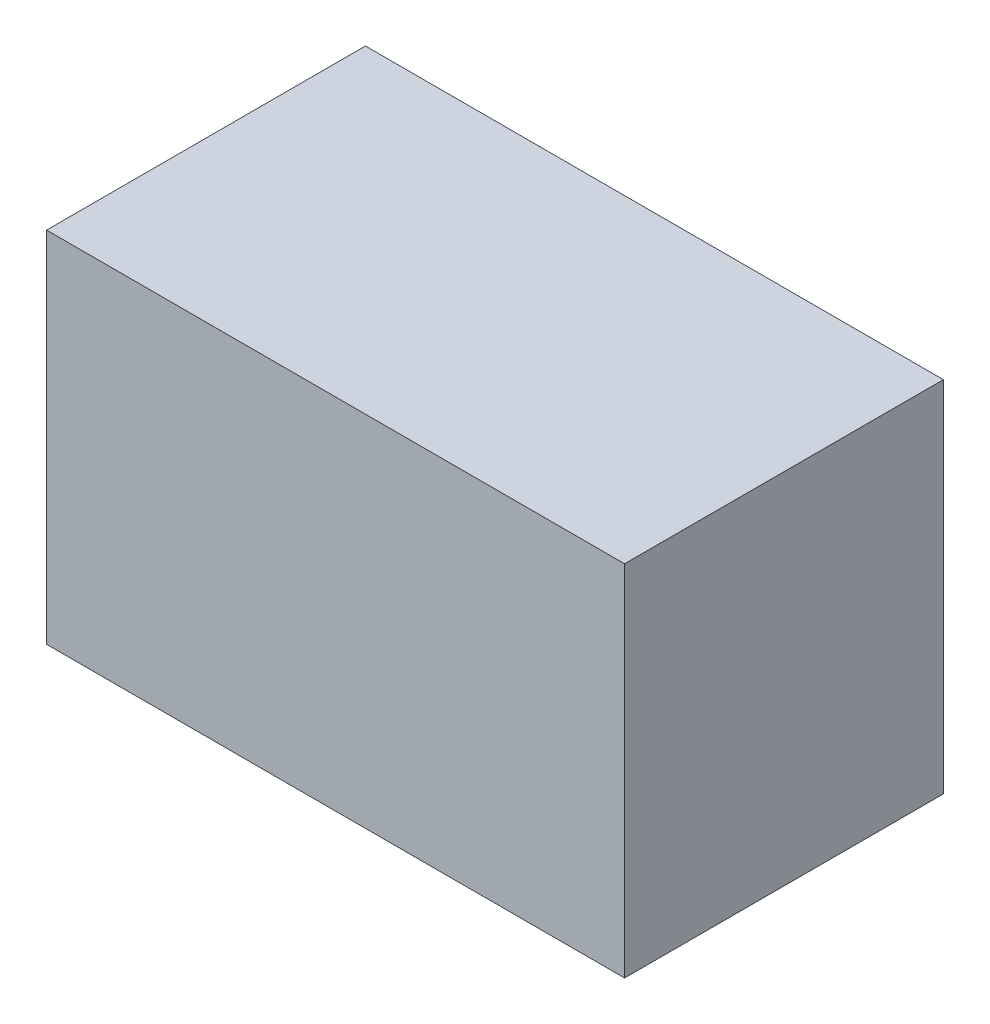
ISO-10303-21;
HEADER;
FILE_DESCRIPTION(('STEP AP214'),'2;1');
FILE_NAME('part.step','',(''),(''),'','','');
FILE_SCHEMA(('AUTOMOTIVE_DESIGN { 1 0 10303 214 1 1 1 1 }'));
ENDSEC;
DATA;
#1=APPLICATION_CONTEXT('core data for automotive mechanical design processes');
#2=APPLICATION_PROTOCOL_DEFINITION('international standard','automotive_design',2000,#1);
#3=PRODUCT_CONTEXT('',#1,'mechanical');
#4=PRODUCT('Part','Part','',(#3));
#5=PRODUCT_RELATED_PRODUCT_CATEGORY('part','',(#4));
#6=PRODUCT_DEFINITION_FORMATION('','',#4);
#7=PRODUCT_DEFINITION_CONTEXT('part definition',#1,'design');
#8=PRODUCT_DEFINITION('design','',#6,#7);
#9=PRODUCT_DEFINITION_SHAPE('','',#8);
#10=(LENGTH_UNIT() NAMED_UNIT(*) SI_UNIT(.MILLI.,.METRE.));
#11=(NAMED_UNIT(*) PLANE_ANGLE_UNIT() SI_UNIT($,.RADIAN.));
#12=(NAMED_UNIT(*) SI_UNIT($,.STERADIAN.) SOLID_ANGLE_UNIT());
#13=UNCERTAINTY_MEASURE_WITH_UNIT(LENGTH_MEASURE(1.E-05),#10,'distance_accuracy_value','');
#14=(GEOMETRIC_REPRESENTATION_CONTEXT(3) GLOBAL_UNCERTAINTY_ASSIGNED_CONTEXT((#13)) GLOBAL_UNIT_ASSIGNED_CONTEXT((#10,
#11,#12)) REPRESENTATION_CONTEXT('',''));
#15=CARTESIAN_POINT('',(0.,0.,0.));
#16=DIRECTION('',(0.,0.,1.));
#17=DIRECTION('',(1.,0.,0.));
#18=AXIS2_PLACEMENT_3D('',#15,#16,#17);
#19=CARTESIAN_POINT('',(6.7,4.5,10.));
#20=DIRECTION('',(0.,0.,-1.));
#21=DIRECTION('',(-1.,0.,0.));
#22=AXIS2_PLACEMENT_3D('',#19,#20,#21);
#23=PLANE('',#22);
#24=DIRECTION('',(0.,1.,0.));
#25=VECTOR('',#24,1.);
#26=CARTESIAN_POINT('',(-7.8,4.5,10.));
#27=LINE('',#26,#25);
#28=CARTESIAN_POINT('',(-7.8,4.5,10.));
#29=VERTEX_POINT('',#28);
#30=CARTESIAN_POINT('',(-7.8,-4.5,10.));
#31=VERTEX_POINT('',#30);
#32=EDGE_CURVE('E55',#29,#31,#27,.F.);
#33=ORIENTED_EDGE('',*,*,#32,.T.);
#34=DIRECTION('',(1.,0.,0.));
#35=VECTOR('',#34,1.);
#36=CARTESIAN_POINT('',(-7.8,-4.5,10.));
#37=LINE('',#36,#35);
#38=CARTESIAN_POINT('',(6.7,-4.5,10.));
#39=VERTEX_POINT('',#38);
#40=EDGE_CURVE('E57',#31,#39,#37,.T.);
#41=ORIENTED_EDGE('',*,*,#40,.T.);
#42=DIRECTION('',(0.,1.,0.));
#43=VECTOR('',#42,1.);
#44=CARTESIAN_POINT('',(6.7,-4.5,10.));
#45=LINE('',#44,#43);
#46=CARTESIAN_POINT('',(6.7,4.5,10.));
#47=VERTEX_POINT('',#46);
#48=EDGE_CURVE('E20',#39,#47,#45,.T.);
#49=ORIENTED_EDGE('',*,*,#48,.T.);
#50=DIRECTION('',(1.,0.,0.));
#51=VECTOR('',#50,1.);
#52=CARTESIAN_POINT('',(6.7,4.5,10.));
#53=LINE('',#52,#51);
#54=EDGE_CURVE('E80',#47,#29,#53,.F.);
#55=ORIENTED_EDGE('',*,*,#54,.T.);
#56=EDGE_LOOP('',(#33,#41,#49,#55));
#57=FACE_BOUND('',#56,.T.);
#58=ADVANCED_FACE('F17',(#57),#23,.F.);
#59=CARTESIAN_POINT('',(6.7,-4.5,2.));
#60=DIRECTION('',(-1.,0.,0.));
#61=DIRECTION('',(0.,0.,1.));
#62=AXIS2_PLACEMENT_3D('',#59,#60,#61);
#63=PLANE('',#62);
#64=DIRECTION('',(0.,0.,-1.));
#65=VECTOR('',#64,1.);
#66=CARTESIAN_POINT('',(6.7,4.5,2.));
#67=LINE('',#66,#65);
#68=CARTESIAN_POINT('',(6.7,4.5,2.));
#69=VERTEX_POINT('',#68);
#70=EDGE_CURVE('E68',#69,#47,#67,.F.);
#71=ORIENTED_EDGE('',*,*,#70,.T.);
#72=ORIENTED_EDGE('',*,*,#48,.F.);
#73=DIRECTION('',(0.,0.,1.));
#74=VECTOR('',#73,1.);
#75=CARTESIAN_POINT('',(6.7,-4.5,2.));
#76=LINE('',#75,#74);
#77=CARTESIAN_POINT('',(6.7,-4.5,2.));
#78=VERTEX_POINT('',#77);
#79=EDGE_CURVE('E63',#39,#78,#76,.F.);
#80=ORIENTED_EDGE('',*,*,#79,.T.);
#81=DIRECTION('',(0.,1.,0.));
#82=VECTOR('',#81,1.);
#83=CARTESIAN_POINT('',(6.7,4.5,2.));
#84=LINE('',#83,#82);
#85=EDGE_CURVE('E83',#69,#78,#84,.F.);
#86=ORIENTED_EDGE('',*,*,#85,.F.);
#87=EDGE_LOOP('',(#71,#72,#80,#86));
#88=FACE_BOUND('',#87,.T.);
#89=ADVANCED_FACE('F65',(#88),#63,.F.);
#90=CARTESIAN_POINT('',(-7.8,-4.5,2.));
#91=DIRECTION('',(0.,1.,0.));
#92=DIRECTION('',(0.,0.,1.));
#93=AXIS2_PLACEMENT_3D('',#90,#91,#92);
#94=PLANE('',#93);
#95=ORIENTED_EDGE('',*,*,#79,.F.);
#96=ORIENTED_EDGE('',*,*,#40,.F.);
#97=DIRECTION('',(0.,0.,-1.));
#98=VECTOR('',#97,1.);
#99=CARTESIAN_POINT('',(-7.8,-4.5,2.));
#100=LINE('',#99,#98);
#101=CARTESIAN_POINT('',(-7.8,-4.5,2.));
#102=VERTEX_POINT('',#101);
#103=EDGE_CURVE('E75',#31,#102,#100,.T.);
#104=ORIENTED_EDGE('',*,*,#103,.T.);
#105=DIRECTION('',(-1.,0.,0.));
#106=VECTOR('',#105,1.);
#107=CARTESIAN_POINT('',(6.7,-4.5,2.));
#108=LINE('',#107,#106);
#109=EDGE_CURVE('E72',#78,#102,#108,.T.);
#110=ORIENTED_EDGE('',*,*,#109,.F.);
#111=EDGE_LOOP('',(#95,#96,#104,#110));
#112=FACE_BOUND('',#111,.T.);
#113=ADVANCED_FACE('F70',(#112),#94,.F.);
#114=CARTESIAN_POINT('',(-7.8,4.5,2.));
#115=DIRECTION('',(1.,0.,0.));
#116=DIRECTION('',(0.,0.,-1.));
#117=AXIS2_PLACEMENT_3D('',#114,#115,#116);
#118=PLANE('',#117);
#119=ORIENTED_EDGE('',*,*,#103,.F.);
#120=ORIENTED_EDGE('',*,*,#32,.F.);
#121=DIRECTION('',(0.,0.,-1.));
#122=VECTOR('',#121,1.);
#123=CARTESIAN_POINT('',(-7.8,4.5,2.));
#124=LINE('',#123,#122);
#125=CARTESIAN_POINT('',(-7.8,4.5,2.));
#126=VERTEX_POINT('',#125);
#127=EDGE_CURVE('E35',#29,#126,#124,.T.);
#128=ORIENTED_EDGE('',*,*,#127,.T.);
#129=DIRECTION('',(0.,1.,0.));
#130=VECTOR('',#129,1.);
#131=CARTESIAN_POINT('',(-7.8,4.5,2.));
#132=LINE('',#131,#130);
#133=EDGE_CURVE('E26',#102,#126,#132,.T.);
#134=ORIENTED_EDGE('',*,*,#133,.F.);
#135=EDGE_LOOP('',(#119,#120,#128,#134));
#136=FACE_BOUND('',#135,.T.);
#137=ADVANCED_FACE('F89',(#136),#118,.F.);
#138=CARTESIAN_POINT('',(6.7,4.5,2.));
#139=DIRECTION('',(0.,-1.,0.));
#140=DIRECTION('',(0.,0.,-1.));
#141=AXIS2_PLACEMENT_3D('',#138,#139,#140);
#142=PLANE('',#141);
#143=ORIENTED_EDGE('',*,*,#127,.F.);
#144=ORIENTED_EDGE('',*,*,#54,.F.);
#145=ORIENTED_EDGE('',*,*,#70,.F.);
#146=DIRECTION('',(-1.,0.,0.));
#147=VECTOR('',#146,1.);
#148=CARTESIAN_POINT('',(6.7,4.5,2.));
#149=LINE('',#148,#147);
#150=EDGE_CURVE('E11',#126,#69,#149,.F.);
#151=ORIENTED_EDGE('',*,*,#150,.F.);
#152=EDGE_LOOP('',(#143,#144,#145,#151));
#153=FACE_BOUND('',#152,.T.);
#154=ADVANCED_FACE('F91',(#153),#142,.F.);
#155=CARTESIAN_POINT('',(6.7,4.5,2.));
#156=DIRECTION('',(0.,0.,-1.));
#157=DIRECTION('',(-1.,0.,0.));
#158=AXIS2_PLACEMENT_3D('',#155,#156,#157);
#159=PLANE('',#158);
#160=ORIENTED_EDGE('',*,*,#133,.T.);
#161=ORIENTED_EDGE('',*,*,#150,.T.);
#162=ORIENTED_EDGE('',*,*,#85,.T.);
#163=ORIENTED_EDGE('',*,*,#109,.T.);
#164=EDGE_LOOP('',(#160,#161,#162,#163));
#165=FACE_BOUND('',#164,.T.);
#166=ADVANCED_FACE('F88',(#165),#159,.T.);
#167=CLOSED_SHELL('',(#58,#89,#113,#137,#154,#166));
#168=MANIFOLD_SOLID_BREP('B1',#167);
#169=ADVANCED_BREP_SHAPE_REPRESENTATION('',(#18,#168),#14);
#170=SHAPE_DEFINITION_REPRESENTATION(#9,#169);
ENDSEC;
END-ISO-10303-21;
